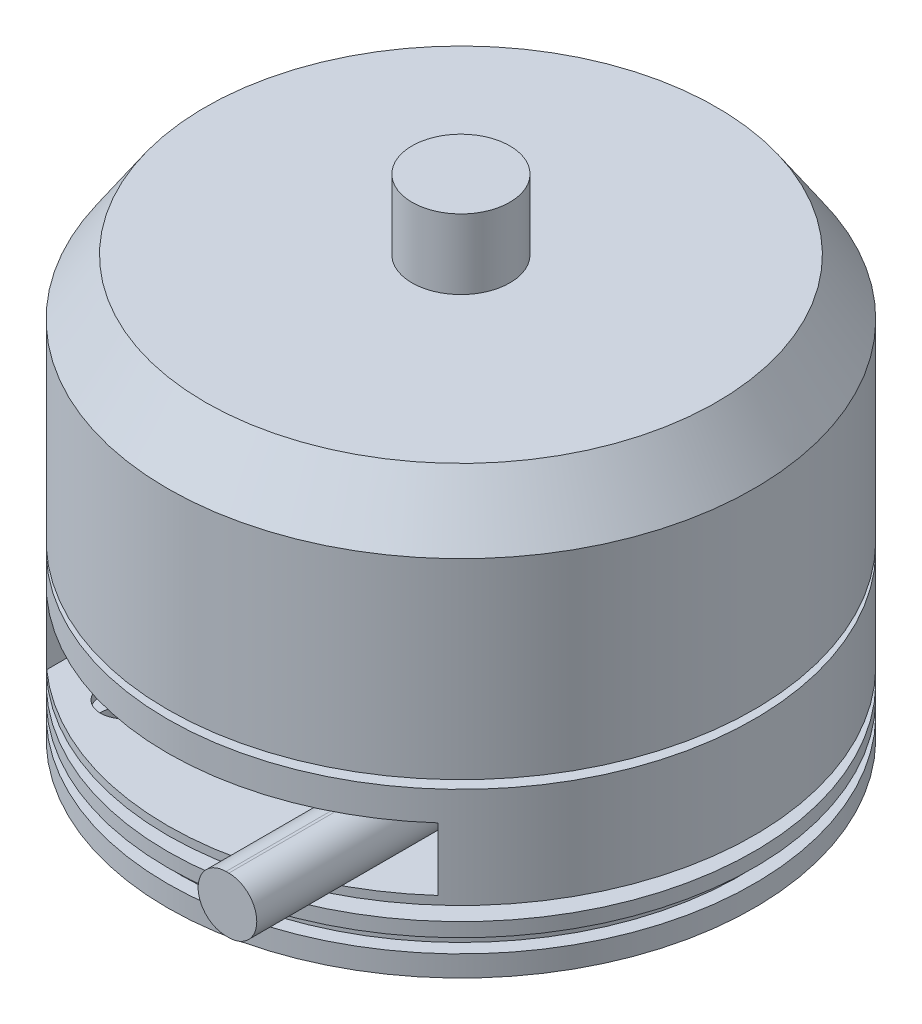
ISO-10303-21;
HEADER;
FILE_DESCRIPTION(('STEP AP214'),'2;1');
FILE_NAME('part.step','',(''),(''),'','','');
FILE_SCHEMA(('AUTOMOTIVE_DESIGN { 1 0 10303 214 1 1 1 1 }'));
ENDSEC;
DATA;
#1=APPLICATION_CONTEXT('core data for automotive mechanical design processes');
#2=APPLICATION_PROTOCOL_DEFINITION('international standard','automotive_design',2000,#1);
#3=PRODUCT_CONTEXT('',#1,'mechanical');
#4=PRODUCT('Part','Part','',(#3));
#5=PRODUCT_RELATED_PRODUCT_CATEGORY('part','',(#4));
#6=PRODUCT_DEFINITION_FORMATION('','',#4);
#7=PRODUCT_DEFINITION_CONTEXT('part definition',#1,'design');
#8=PRODUCT_DEFINITION('design','',#6,#7);
#9=PRODUCT_DEFINITION_SHAPE('','',#8);
#10=(LENGTH_UNIT() NAMED_UNIT(*) SI_UNIT(.MILLI.,.METRE.));
#11=(NAMED_UNIT(*) PLANE_ANGLE_UNIT() SI_UNIT($,.RADIAN.));
#12=(NAMED_UNIT(*) SI_UNIT($,.STERADIAN.) SOLID_ANGLE_UNIT());
#13=UNCERTAINTY_MEASURE_WITH_UNIT(LENGTH_MEASURE(1.E-05),#10,'distance_accuracy_value','');
#14=(GEOMETRIC_REPRESENTATION_CONTEXT(3) GLOBAL_UNCERTAINTY_ASSIGNED_CONTEXT((#13)) GLOBAL_UNIT_ASSIGNED_CONTEXT((#10,
#11,#12)) REPRESENTATION_CONTEXT('',''));
#15=CARTESIAN_POINT('',(0.,0.,0.));
#16=DIRECTION('',(0.,0.,1.));
#17=DIRECTION('',(1.,0.,0.));
#18=AXIS2_PLACEMENT_3D('',#15,#16,#17);
#19=CARTESIAN_POINT('',(13.4,8.7,0.));
#20=DIRECTION('',(0.,1.,0.));
#21=DIRECTION('',(0.,0.,1.));
#22=AXIS2_PLACEMENT_3D('',#19,#20,#21);
#23=PLANE('',#22);
#24=CARTESIAN_POINT('',(9.36869611910201,8.7,-14.7809855228913));
#25=DIRECTION('',(0.,-1.,0.));
#26=DIRECTION('',(0.,0.,-1.));
#27=AXIS2_PLACEMENT_3D('',#24,#25,#26);
#28=CIRCLE('',#27,1.64999999999999);
#29=CARTESIAN_POINT('',(9.36869611910201,8.7,-16.4309855228913));
#30=VERTEX_POINT('',#29);
#31=EDGE_CURVE('E152',#30,#30,#28,.T.);
#32=ORIENTED_EDGE('',*,*,#31,.F.);
#33=EDGE_LOOP('',(#32));
#34=FACE_BOUND('',#33,.T.);
#35=CARTESIAN_POINT('',(14.7809855228913,8.7,9.36869611910201));
#36=DIRECTION('',(0.,-1.,0.));
#37=DIRECTION('',(0.,0.,-1.));
#38=AXIS2_PLACEMENT_3D('',#35,#36,#37);
#39=CIRCLE('',#38,1.64999999999999);
#40=CARTESIAN_POINT('',(14.7809855228913,8.7,7.71869611910202));
#41=VERTEX_POINT('',#40);
#42=EDGE_CURVE('E162',#41,#41,#39,.T.);
#43=ORIENTED_EDGE('',*,*,#42,.F.);
#44=EDGE_LOOP('',(#43));
#45=FACE_BOUND('',#44,.T.);
#46=CARTESIAN_POINT('',(0.,8.7,0.));
#47=DIRECTION('',(0.,1.,0.));
#48=DIRECTION('',(0.,0.,1.));
#49=AXIS2_PLACEMENT_3D('',#46,#47,#48);
#50=CIRCLE('',#49,21.);
#51=CARTESIAN_POINT('',(0.,8.7,21.));
#52=VERTEX_POINT('',#51);
#53=EDGE_CURVE('E271',#52,#52,#50,.T.);
#54=ORIENTED_EDGE('',*,*,#53,.F.);
#55=EDGE_LOOP('',(#54));
#56=FACE_BOUND('',#55,.T.);
#57=CARTESIAN_POINT('',(0.,8.7,0.));
#58=DIRECTION('',(0.,1.,0.));
#59=DIRECTION('',(0.,0.,1.));
#60=AXIS2_PLACEMENT_3D('',#57,#58,#59);
#61=CIRCLE('',#60,13.4);
#62=CARTESIAN_POINT('',(0.,8.7,13.4));
#63=VERTEX_POINT('',#62);
#64=EDGE_CURVE('E274',#63,#63,#61,.T.);
#65=ORIENTED_EDGE('',*,*,#64,.T.);
#66=EDGE_LOOP('',(#65));
#67=FACE_BOUND('',#66,.T.);
#68=CARTESIAN_POINT('',(-9.36869611910201,8.7,14.7809855228913));
#69=DIRECTION('',(0.,-1.,0.));
#70=DIRECTION('',(0.,0.,-1.));
#71=AXIS2_PLACEMENT_3D('',#68,#69,#70);
#72=CIRCLE('',#71,1.64999999999999);
#73=CARTESIAN_POINT('',(-9.36869611910201,8.7,13.1309855228913));
#74=VERTEX_POINT('',#73);
#75=EDGE_CURVE('E136',#74,#74,#72,.T.);
#76=ORIENTED_EDGE('',*,*,#75,.F.);
#77=EDGE_LOOP('',(#76));
#78=FACE_BOUND('',#77,.T.);
#79=CARTESIAN_POINT('',(-14.7809855228913,8.7,-9.36869611910201));
#80=DIRECTION('',(0.,-1.,0.));
#81=DIRECTION('',(0.,0.,-1.));
#82=AXIS2_PLACEMENT_3D('',#79,#80,#81);
#83=CIRCLE('',#82,1.64999999999999);
#84=CARTESIAN_POINT('',(-14.7809855228913,8.7,-11.018696119102));
#85=VERTEX_POINT('',#84);
#86=EDGE_CURVE('E127',#85,#85,#83,.T.);
#87=ORIENTED_EDGE('',*,*,#86,.F.);
#88=EDGE_LOOP('',(#87));
#89=FACE_BOUND('',#88,.T.);
#90=ADVANCED_FACE('F40',(#34,#45,#56,#67,#78,#89),#23,.F.);
#91=CARTESIAN_POINT('',(0.,0.,11.));
#92=DIRECTION('',(0.,0.,1.));
#93=DIRECTION('',(1.,0.,0.));
#94=AXIS2_PLACEMENT_3D('',#91,#92,#93);
#95=PLANE('',#94);
#96=DIRECTION('',(0.,1.,0.));
#97=VECTOR('',#96,1.);
#98=CARTESIAN_POINT('',(14.,18.3,11.));
#99=LINE('',#98,#97);
#100=CARTESIAN_POINT('',(14.,13.8,11.));
#101=VERTEX_POINT('',#100);
#102=CARTESIAN_POINT('',(14.,18.3,11.));
#103=VERTEX_POINT('',#102);
#104=EDGE_CURVE('E201',#101,#103,#99,.T.);
#105=ORIENTED_EDGE('',*,*,#104,.T.);
#106=DIRECTION('',(-1.,0.,0.));
#107=VECTOR('',#106,1.);
#108=CARTESIAN_POINT('',(-14.,18.3,11.));
#109=LINE('',#108,#107);
#110=CARTESIAN_POINT('',(-14.,18.3,11.));
#111=VERTEX_POINT('',#110);
#112=EDGE_CURVE('E204',#103,#111,#109,.T.);
#113=ORIENTED_EDGE('',*,*,#112,.T.);
#114=DIRECTION('',(0.,-1.,0.));
#115=VECTOR('',#114,1.);
#116=CARTESIAN_POINT('',(-14.,18.3,11.));
#117=LINE('',#116,#115);
#118=CARTESIAN_POINT('',(-14.,13.8,11.));
#119=VERTEX_POINT('',#118);
#120=EDGE_CURVE('E207',#111,#119,#117,.T.);
#121=ORIENTED_EDGE('',*,*,#120,.T.);
#122=DIRECTION('',(1.,0.,0.));
#123=VECTOR('',#122,1.);
#124=CARTESIAN_POINT('',(-14.,13.8,11.));
#125=LINE('',#124,#123);
#126=EDGE_CURVE('E210',#119,#101,#125,.T.);
#127=ORIENTED_EDGE('',*,*,#126,.T.);
#128=EDGE_LOOP('',(#105,#113,#121,#127));
#129=FACE_BOUND('',#128,.T.);
#130=DIRECTION('',(1.,0.,0.));
#131=VECTOR('',#130,1.);
#132=CARTESIAN_POINT('',(9.18505632343501,14.0531944170925,11.));
#133=LINE('',#132,#131);
#134=CARTESIAN_POINT('',(9.18505632343501,14.0531944170925,11.));
#135=VERTEX_POINT('',#134);
#136=CARTESIAN_POINT('',(9.38505632343501,14.0531944170925,11.));
#137=VERTEX_POINT('',#136);
#138=EDGE_CURVE('E188',#135,#137,#133,.T.);
#139=ORIENTED_EDGE('',*,*,#138,.F.);
#140=CARTESIAN_POINT('',(9.18505632343501,16.0531944170925,11.));
#141=DIRECTION('',(0.,0.,1.));
#142=DIRECTION('',(1.,0.,0.));
#143=AXIS2_PLACEMENT_3D('',#140,#141,#142);
#144=CIRCLE('',#143,1.99999999999999);
#145=CARTESIAN_POINT('',(9.18505632343501,18.0531944170925,11.));
#146=VERTEX_POINT('',#145);
#147=EDGE_CURVE('E174',#146,#135,#144,.T.);
#148=ORIENTED_EDGE('',*,*,#147,.F.);
#149=DIRECTION('',(-1.,0.,0.));
#150=VECTOR('',#149,1.);
#151=CARTESIAN_POINT('',(9.18505632343501,18.0531944170925,11.));
#152=LINE('',#151,#150);
#153=CARTESIAN_POINT('',(9.38505632343501,18.0531944170925,11.));
#154=VERTEX_POINT('',#153);
#155=EDGE_CURVE('E179',#154,#146,#152,.T.);
#156=ORIENTED_EDGE('',*,*,#155,.F.);
#157=CARTESIAN_POINT('',(9.38505632343501,16.0531944170925,11.));
#158=DIRECTION('',(0.,0.,1.));
#159=DIRECTION('',(1.,0.,0.));
#160=AXIS2_PLACEMENT_3D('',#157,#158,#159);
#161=CIRCLE('',#160,2.);
#162=EDGE_CURVE('E190',#137,#154,#161,.T.);
#163=ORIENTED_EDGE('',*,*,#162,.F.);
#164=EDGE_LOOP('',(#139,#148,#156,#163));
#165=FACE_BOUND('',#164,.T.);
#166=ADVANCED_FACE('F319',(#129,#165),#95,.T.);
#167=CARTESIAN_POINT('',(0.,0.,0.));
#168=DIRECTION('',(0.,1.,0.));
#169=DIRECTION('',(0.,0.,1.));
#170=AXIS2_PLACEMENT_3D('',#167,#168,#169);
#171=PLANE('',#170);
#172=CARTESIAN_POINT('',(0.,0.,0.));
#173=DIRECTION('',(0.,1.,0.));
#174=DIRECTION('',(0.,0.,1.));
#175=AXIS2_PLACEMENT_3D('',#172,#173,#174);
#176=CIRCLE('',#175,4.1);
#177=CARTESIAN_POINT('',(0.,0.,4.1));
#178=VERTEX_POINT('',#177);
#179=EDGE_CURVE('E283',#178,#178,#176,.T.);
#180=ORIENTED_EDGE('',*,*,#179,.F.);
#181=EDGE_LOOP('',(#180));
#182=FACE_BOUND('',#181,.T.);
#183=ADVANCED_FACE('F42',(#182),#171,.F.);
#184=CARTESIAN_POINT('',(0.,43.7,0.));
#185=DIRECTION('',(0.,1.,0.));
#186=DIRECTION('',(0.,0.,1.));
#187=AXIS2_PLACEMENT_3D('',#184,#185,#186);
#188=CYLINDRICAL_SURFACE('',#187,4.1);
#189=CARTESIAN_POINT('',(0.,6.7,0.));
#190=DIRECTION('',(0.,1.,0.));
#191=DIRECTION('',(0.,0.,1.));
#192=AXIS2_PLACEMENT_3D('',#189,#190,#191);
#193=CIRCLE('',#192,4.1);
#194=CARTESIAN_POINT('',(0.,6.7,4.1));
#195=VERTEX_POINT('',#194);
#196=EDGE_CURVE('E280',#195,#195,#193,.T.);
#197=ORIENTED_EDGE('',*,*,#196,.F.);
#198=EDGE_LOOP('',(#197));
#199=FACE_BOUND('',#198,.T.);
#200=ORIENTED_EDGE('',*,*,#179,.T.);
#201=EDGE_LOOP('',(#200));
#202=FACE_BOUND('',#201,.T.);
#203=ADVANCED_FACE('F339',(#199,#202),#188,.T.);
#204=CARTESIAN_POINT('',(4.1,6.7,0.));
#205=DIRECTION('',(0.,1.,0.));
#206=DIRECTION('',(0.,0.,1.));
#207=AXIS2_PLACEMENT_3D('',#204,#205,#206);
#208=PLANE('',#207);
#209=CARTESIAN_POINT('',(0.,6.7,0.));
#210=DIRECTION('',(0.,1.,0.));
#211=DIRECTION('',(0.,0.,1.));
#212=AXIS2_PLACEMENT_3D('',#209,#210,#211);
#213=CIRCLE('',#212,13.4);
#214=CARTESIAN_POINT('',(0.,6.7,13.4));
#215=VERTEX_POINT('',#214);
#216=EDGE_CURVE('E277',#215,#215,#213,.T.);
#217=ORIENTED_EDGE('',*,*,#216,.F.);
#218=EDGE_LOOP('',(#217));
#219=FACE_BOUND('',#218,.T.);
#220=ORIENTED_EDGE('',*,*,#196,.T.);
#221=EDGE_LOOP('',(#220));
#222=FACE_BOUND('',#221,.T.);
#223=ADVANCED_FACE('F336',(#219,#222),#208,.F.);
#224=CARTESIAN_POINT('',(0.,43.7,0.));
#225=DIRECTION('',(0.,1.,0.));
#226=DIRECTION('',(0.,0.,1.));
#227=AXIS2_PLACEMENT_3D('',#224,#225,#226);
#228=CYLINDRICAL_SURFACE('',#227,13.4);
#229=ORIENTED_EDGE('',*,*,#64,.F.);
#230=EDGE_LOOP('',(#229));
#231=FACE_BOUND('',#230,.T.);
#232=ORIENTED_EDGE('',*,*,#216,.T.);
#233=EDGE_LOOP('',(#232));
#234=FACE_BOUND('',#233,.T.);
#235=ADVANCED_FACE('F333',(#231,#234),#228,.T.);
#236=CARTESIAN_POINT('',(0.,43.7,0.));
#237=DIRECTION('',(0.,1.,0.));
#238=DIRECTION('',(0.,0.,1.));
#239=AXIS2_PLACEMENT_3D('',#236,#237,#238);
#240=CYLINDRICAL_SURFACE('',#239,21.);
#241=CARTESIAN_POINT('',(0.,10.2,0.));
#242=DIRECTION('',(0.,1.,0.));
#243=DIRECTION('',(0.,0.,1.));
#244=AXIS2_PLACEMENT_3D('',#241,#242,#243);
#245=CIRCLE('',#244,21.);
#246=CARTESIAN_POINT('',(0.,10.2,21.));
#247=VERTEX_POINT('',#246);
#248=EDGE_CURVE('E268',#247,#247,#245,.T.);
#249=ORIENTED_EDGE('',*,*,#248,.F.);
#250=EDGE_LOOP('',(#249));
#251=FACE_BOUND('',#250,.T.);
#252=ORIENTED_EDGE('',*,*,#53,.T.);
#253=EDGE_LOOP('',(#252));
#254=FACE_BOUND('',#253,.T.);
#255=ADVANCED_FACE('F331',(#251,#254),#240,.T.);
#256=CARTESIAN_POINT('',(21.,10.2,0.));
#257=DIRECTION('',(0.,-1.,0.));
#258=DIRECTION('',(0.,0.,-1.));
#259=AXIS2_PLACEMENT_3D('',#256,#257,#258);
#260=PLANE('',#259);
#261=CARTESIAN_POINT('',(0.,10.2,0.));
#262=DIRECTION('',(0.,1.,0.));
#263=DIRECTION('',(0.,0.,1.));
#264=AXIS2_PLACEMENT_3D('',#261,#262,#263);
#265=CIRCLE('',#264,20.);
#266=CARTESIAN_POINT('',(0.,10.2,20.));
#267=VERTEX_POINT('',#266);
#268=EDGE_CURVE('E265',#267,#267,#265,.T.);
#269=ORIENTED_EDGE('',*,*,#268,.F.);
#270=EDGE_LOOP('',(#269));
#271=FACE_BOUND('',#270,.T.);
#272=ORIENTED_EDGE('',*,*,#248,.T.);
#273=EDGE_LOOP('',(#272));
#274=FACE_BOUND('',#273,.T.);
#275=ADVANCED_FACE('F708',(#271,#274),#260,.F.);
#276=CARTESIAN_POINT('',(0.,43.7,0.));
#277=DIRECTION('',(0.,1.,0.));
#278=DIRECTION('',(0.,0.,1.));
#279=AXIS2_PLACEMENT_3D('',#276,#277,#278);
#280=CYLINDRICAL_SURFACE('',#279,20.);
#281=CARTESIAN_POINT('',(0.,11.2,0.));
#282=DIRECTION('',(0.,1.,0.));
#283=DIRECTION('',(0.,0.,1.));
#284=AXIS2_PLACEMENT_3D('',#281,#282,#283);
#285=CIRCLE('',#284,20.);
#286=CARTESIAN_POINT('',(0.,11.2,20.));
#287=VERTEX_POINT('',#286);
#288=EDGE_CURVE('E262',#287,#287,#285,.T.);
#289=ORIENTED_EDGE('',*,*,#288,.F.);
#290=EDGE_LOOP('',(#289));
#291=FACE_BOUND('',#290,.T.);
#292=ORIENTED_EDGE('',*,*,#268,.T.);
#293=EDGE_LOOP('',(#292));
#294=FACE_BOUND('',#293,.T.);
#295=ADVANCED_FACE('F705',(#291,#294),#280,.T.);
#296=CARTESIAN_POINT('',(20.,11.2,0.));
#297=DIRECTION('',(0.,1.,0.));
#298=DIRECTION('',(0.,0.,1.));
#299=AXIS2_PLACEMENT_3D('',#296,#297,#298);
#300=PLANE('',#299);
#301=CARTESIAN_POINT('',(0.,11.2,0.));
#302=DIRECTION('',(0.,1.,0.));
#303=DIRECTION('',(0.,0.,1.));
#304=AXIS2_PLACEMENT_3D('',#301,#302,#303);
#305=CIRCLE('',#304,21.);
#306=CARTESIAN_POINT('',(0.,11.2,21.));
#307=VERTEX_POINT('',#306);
#308=EDGE_CURVE('E259',#307,#307,#305,.T.);
#309=ORIENTED_EDGE('',*,*,#308,.F.);
#310=EDGE_LOOP('',(#309));
#311=FACE_BOUND('',#310,.T.);
#312=ORIENTED_EDGE('',*,*,#288,.T.);
#313=EDGE_LOOP('',(#312));
#314=FACE_BOUND('',#313,.T.);
#315=ADVANCED_FACE('F701',(#311,#314),#300,.F.);
#316=CARTESIAN_POINT('',(0.,43.7,0.));
#317=DIRECTION('',(0.,1.,0.));
#318=DIRECTION('',(0.,0.,1.));
#319=AXIS2_PLACEMENT_3D('',#316,#317,#318);
#320=CYLINDRICAL_SURFACE('',#319,21.);
#321=CARTESIAN_POINT('',(0.,12.2,0.));
#322=DIRECTION('',(0.,1.,0.));
#323=DIRECTION('',(0.,0.,1.));
#324=AXIS2_PLACEMENT_3D('',#321,#322,#323);
#325=CIRCLE('',#324,21.);
#326=CARTESIAN_POINT('',(0.,12.2,21.));
#327=VERTEX_POINT('',#326);
#328=EDGE_CURVE('E256',#327,#327,#325,.T.);
#329=ORIENTED_EDGE('',*,*,#328,.F.);
#330=EDGE_LOOP('',(#329));
#331=FACE_BOUND('',#330,.T.);
#332=ORIENTED_EDGE('',*,*,#308,.T.);
#333=EDGE_LOOP('',(#332));
#334=FACE_BOUND('',#333,.T.);
#335=ADVANCED_FACE('F433',(#331,#334),#320,.T.);
#336=CARTESIAN_POINT('',(21.,12.2,0.));
#337=DIRECTION('',(0.,-1.,0.));
#338=DIRECTION('',(0.,0.,-1.));
#339=AXIS2_PLACEMENT_3D('',#336,#337,#338);
#340=PLANE('',#339);
#341=CARTESIAN_POINT('',(-14.7809855228913,12.2,-9.36869611910201));
#342=DIRECTION('',(0.,-1.,0.));
#343=DIRECTION('',(0.,0.,-1.));
#344=AXIS2_PLACEMENT_3D('',#341,#342,#343);
#345=CIRCLE('',#344,1.64999999999999);
#346=CARTESIAN_POINT('',(-14.7809855228913,12.2,-11.018696119102));
#347=VERTEX_POINT('',#346);
#348=EDGE_CURVE('E44',#347,#347,#345,.T.);
#349=ORIENTED_EDGE('',*,*,#348,.T.);
#350=EDGE_LOOP('',(#349));
#351=FACE_BOUND('',#350,.T.);
#352=CARTESIAN_POINT('',(-9.36869611910201,12.2,14.7809855228913));
#353=DIRECTION('',(0.,-1.,0.));
#354=DIRECTION('',(0.,0.,-1.));
#355=AXIS2_PLACEMENT_3D('',#352,#353,#354);
#356=CIRCLE('',#355,1.64999999999999);
#357=CARTESIAN_POINT('',(-9.36869611910201,12.2,13.1309855228913));
#358=VERTEX_POINT('',#357);
#359=EDGE_CURVE('E149',#358,#358,#356,.T.);
#360=ORIENTED_EDGE('',*,*,#359,.T.);
#361=EDGE_LOOP('',(#360));
#362=FACE_BOUND('',#361,.T.);
#363=CARTESIAN_POINT('',(9.36869611910201,12.2,-14.7809855228913));
#364=DIRECTION('',(0.,-1.,0.));
#365=DIRECTION('',(0.,0.,-1.));
#366=AXIS2_PLACEMENT_3D('',#363,#364,#365);
#367=CIRCLE('',#366,1.64999999999999);
#368=CARTESIAN_POINT('',(9.36869611910201,12.2,-16.4309855228913));
#369=VERTEX_POINT('',#368);
#370=EDGE_CURVE('E159',#369,#369,#367,.T.);
#371=ORIENTED_EDGE('',*,*,#370,.T.);
#372=EDGE_LOOP('',(#371));
#373=FACE_BOUND('',#372,.T.);
#374=CARTESIAN_POINT('',(14.7809855228913,12.2,9.36869611910201));
#375=DIRECTION('',(0.,-1.,0.));
#376=DIRECTION('',(0.,0.,-1.));
#377=AXIS2_PLACEMENT_3D('',#374,#375,#376);
#378=CIRCLE('',#377,1.64999999999999);
#379=CARTESIAN_POINT('',(14.7809855228913,12.2,7.71869611910202));
#380=VERTEX_POINT('',#379);
#381=EDGE_CURVE('E168',#380,#380,#378,.T.);
#382=ORIENTED_EDGE('',*,*,#381,.T.);
#383=EDGE_LOOP('',(#382));
#384=FACE_BOUND('',#383,.T.);
#385=CARTESIAN_POINT('',(0.,12.2,0.));
#386=DIRECTION('',(0.,1.,0.));
#387=DIRECTION('',(0.,0.,1.));
#388=AXIS2_PLACEMENT_3D('',#385,#386,#387);
#389=CIRCLE('',#388,10.);
#390=CARTESIAN_POINT('',(0.,12.2,10.));
#391=VERTEX_POINT('',#390);
#392=EDGE_CURVE('E253',#391,#391,#389,.T.);
#393=ORIENTED_EDGE('',*,*,#392,.F.);
#394=EDGE_LOOP('',(#393));
#395=FACE_BOUND('',#394,.T.);
#396=ORIENTED_EDGE('',*,*,#328,.T.);
#397=EDGE_LOOP('',(#396));
#398=FACE_BOUND('',#397,.T.);
#399=ADVANCED_FACE('F427',(#351,#362,#373,#384,#395,#398),#340,.F.);
#400=CARTESIAN_POINT('',(0.,43.7,0.));
#401=DIRECTION('',(0.,1.,0.));
#402=DIRECTION('',(0.,0.,1.));
#403=AXIS2_PLACEMENT_3D('',#400,#401,#402);
#404=CYLINDRICAL_SURFACE('',#403,10.);
#405=CARTESIAN_POINT('',(0.,13.2,0.));
#406=DIRECTION('',(0.,1.,0.));
#407=DIRECTION('',(0.,0.,1.));
#408=AXIS2_PLACEMENT_3D('',#405,#406,#407);
#409=CIRCLE('',#408,10.);
#410=CARTESIAN_POINT('',(0.,13.2,10.));
#411=VERTEX_POINT('',#410);
#412=EDGE_CURVE('E250',#411,#411,#409,.T.);
#413=ORIENTED_EDGE('',*,*,#412,.F.);
#414=EDGE_LOOP('',(#413));
#415=FACE_BOUND('',#414,.T.);
#416=ORIENTED_EDGE('',*,*,#392,.T.);
#417=EDGE_LOOP('',(#416));
#418=FACE_BOUND('',#417,.T.);
#419=ADVANCED_FACE('F432',(#415,#418),#404,.T.);
#420=CARTESIAN_POINT('',(10.,13.2,0.));
#421=DIRECTION('',(0.,1.,0.));
#422=DIRECTION('',(0.,0.,1.));
#423=AXIS2_PLACEMENT_3D('',#420,#421,#422);
#424=PLANE('',#423);
#425=CARTESIAN_POINT('',(-14.7809855228913,13.2,-9.36869611910201));
#426=DIRECTION('',(0.,1.,0.));
#427=DIRECTION('',(0.,0.,1.));
#428=AXIS2_PLACEMENT_3D('',#425,#426,#427);
#429=CIRCLE('',#428,1.64999999999999);
#430=CARTESIAN_POINT('',(-14.7809855228913,13.2,-7.71869611910202));
#431=VERTEX_POINT('',#430);
#432=EDGE_CURVE('E130',#431,#431,#429,.T.);
#433=ORIENTED_EDGE('',*,*,#432,.T.);
#434=EDGE_LOOP('',(#433));
#435=FACE_BOUND('',#434,.T.);
#436=CARTESIAN_POINT('',(-9.36869611910201,13.2,14.7809855228913));
#437=DIRECTION('',(0.,1.,0.));
#438=DIRECTION('',(0.,0.,1.));
#439=AXIS2_PLACEMENT_3D('',#436,#437,#438);
#440=CIRCLE('',#439,1.64999999999999);
#441=CARTESIAN_POINT('',(-9.36869611910201,13.2,16.4309855228913));
#442=VERTEX_POINT('',#441);
#443=EDGE_CURVE('E146',#442,#442,#440,.T.);
#444=ORIENTED_EDGE('',*,*,#443,.T.);
#445=EDGE_LOOP('',(#444));
#446=FACE_BOUND('',#445,.T.);
#447=CARTESIAN_POINT('',(9.36869611910201,13.2,-14.7809855228913));
#448=DIRECTION('',(0.,1.,0.));
#449=DIRECTION('',(0.,0.,1.));
#450=AXIS2_PLACEMENT_3D('',#447,#448,#449);
#451=CIRCLE('',#450,1.64999999999999);
#452=CARTESIAN_POINT('',(9.36869611910201,13.2,-13.1309855228913));
#453=VERTEX_POINT('',#452);
#454=EDGE_CURVE('E158',#453,#453,#451,.T.);
#455=ORIENTED_EDGE('',*,*,#454,.T.);
#456=EDGE_LOOP('',(#455));
#457=FACE_BOUND('',#456,.T.);
#458=CARTESIAN_POINT('',(14.7809855228913,13.2,9.36869611910201));
#459=DIRECTION('',(0.,1.,0.));
#460=DIRECTION('',(0.,0.,1.));
#461=AXIS2_PLACEMENT_3D('',#458,#459,#460);
#462=CIRCLE('',#461,1.64999999999999);
#463=CARTESIAN_POINT('',(14.7809855228913,13.2,11.018696119102));
#464=VERTEX_POINT('',#463);
#465=EDGE_CURVE('E171',#464,#464,#462,.T.);
#466=ORIENTED_EDGE('',*,*,#465,.T.);
#467=EDGE_LOOP('',(#466));
#468=FACE_BOUND('',#467,.T.);
#469=CARTESIAN_POINT('',(0.,13.2,0.));
#470=DIRECTION('',(0.,1.,0.));
#471=DIRECTION('',(0.,0.,1.));
#472=AXIS2_PLACEMENT_3D('',#469,#470,#471);
#473=CIRCLE('',#472,21.);
#474=CARTESIAN_POINT('',(0.,13.2,21.));
#475=VERTEX_POINT('',#474);
#476=EDGE_CURVE('E247',#475,#475,#473,.T.);
#477=ORIENTED_EDGE('',*,*,#476,.F.);
#478=EDGE_LOOP('',(#477));
#479=FACE_BOUND('',#478,.T.);
#480=ORIENTED_EDGE('',*,*,#412,.T.);
#481=EDGE_LOOP('',(#480));
#482=FACE_BOUND('',#481,.T.);
#483=ADVANCED_FACE('F443',(#435,#446,#457,#468,#479,#482),#424,.F.);
#484=CARTESIAN_POINT('',(0.,43.7,0.));
#485=DIRECTION('',(0.,1.,0.));
#486=DIRECTION('',(0.,0.,1.));
#487=AXIS2_PLACEMENT_3D('',#484,#485,#486);
#488=CYLINDRICAL_SURFACE('',#487,21.);
#489=CARTESIAN_POINT('',(0.,18.3,0.));
#490=DIRECTION('',(0.,1.,0.));
#491=DIRECTION('',(0.,0.,1.));
#492=AXIS2_PLACEMENT_3D('',#489,#490,#491);
#493=CIRCLE('',#492,21.);
#494=CARTESIAN_POINT('',(-14.,18.3,15.6524758424985));
#495=VERTEX_POINT('',#494);
#496=CARTESIAN_POINT('',(14.,18.3,15.6524758424985));
#497=VERTEX_POINT('',#496);
#498=EDGE_CURVE('E286',#495,#497,#493,.T.);
#499=ORIENTED_EDGE('',*,*,#498,.T.);
#500=DIRECTION('',(0.,1.,0.));
#501=VECTOR('',#500,1.);
#502=CARTESIAN_POINT('',(14.,43.7,15.6524758424985));
#503=LINE('',#502,#501);
#504=CARTESIAN_POINT('',(14.,13.8,15.6524758424985));
#505=VERTEX_POINT('',#504);
#506=EDGE_CURVE('E11',#497,#505,#503,.F.);
#507=ORIENTED_EDGE('',*,*,#506,.T.);
#508=CARTESIAN_POINT('',(0.,13.8,0.));
#509=DIRECTION('',(0.,-1.,0.));
#510=DIRECTION('',(0.,0.,-1.));
#511=AXIS2_PLACEMENT_3D('',#508,#509,#510);
#512=CIRCLE('',#511,21.);
#513=CARTESIAN_POINT('',(-14.,13.8,15.6524758424985));
#514=VERTEX_POINT('',#513);
#515=EDGE_CURVE('E49',#505,#514,#512,.T.);
#516=ORIENTED_EDGE('',*,*,#515,.T.);
#517=DIRECTION('',(0.,1.,0.));
#518=VECTOR('',#517,1.);
#519=CARTESIAN_POINT('',(-14.,43.7,15.6524758424985));
#520=LINE('',#519,#518);
#521=EDGE_CURVE('E288',#514,#495,#520,.T.);
#522=ORIENTED_EDGE('',*,*,#521,.T.);
#523=EDGE_LOOP('',(#499,#507,#516,#522));
#524=FACE_BOUND('',#523,.T.);
#525=CARTESIAN_POINT('',(0.,20.4,0.));
#526=DIRECTION('',(0.,1.,0.));
#527=DIRECTION('',(0.,0.,1.));
#528=AXIS2_PLACEMENT_3D('',#525,#526,#527);
#529=CIRCLE('',#528,21.);
#530=CARTESIAN_POINT('',(0.,20.4,21.));
#531=VERTEX_POINT('',#530);
#532=EDGE_CURVE('E244',#531,#531,#529,.T.);
#533=ORIENTED_EDGE('',*,*,#532,.F.);
#534=EDGE_LOOP('',(#533));
#535=FACE_BOUND('',#534,.T.);
#536=ORIENTED_EDGE('',*,*,#476,.T.);
#537=EDGE_LOOP('',(#536));
#538=FACE_BOUND('',#537,.T.);
#539=ADVANCED_FACE('F448',(#524,#535,#538),#488,.T.);
#540=CARTESIAN_POINT('',(21.,20.4,0.));
#541=DIRECTION('',(0.,-1.,0.));
#542=DIRECTION('',(0.,0.,-1.));
#543=AXIS2_PLACEMENT_3D('',#540,#541,#542);
#544=PLANE('',#543);
#545=CARTESIAN_POINT('',(0.,20.4,0.));
#546=DIRECTION('',(0.,1.,0.));
#547=DIRECTION('',(0.,0.,1.));
#548=AXIS2_PLACEMENT_3D('',#545,#546,#547);
#549=CIRCLE('',#548,5.);
#550=CARTESIAN_POINT('',(0.,20.4,5.));
#551=VERTEX_POINT('',#550);
#552=EDGE_CURVE('E241',#551,#551,#549,.T.);
#553=ORIENTED_EDGE('',*,*,#552,.F.);
#554=EDGE_LOOP('',(#553));
#555=FACE_BOUND('',#554,.T.);
#556=ORIENTED_EDGE('',*,*,#532,.T.);
#557=EDGE_LOOP('',(#556));
#558=FACE_BOUND('',#557,.T.);
#559=ADVANCED_FACE('F626',(#555,#558),#544,.F.);
#560=CARTESIAN_POINT('',(0.,43.7,0.));
#561=DIRECTION('',(0.,1.,0.));
#562=DIRECTION('',(0.,0.,1.));
#563=AXIS2_PLACEMENT_3D('',#560,#561,#562);
#564=CYLINDRICAL_SURFACE('',#563,5.);
#565=CARTESIAN_POINT('',(0.,21.,0.));
#566=DIRECTION('',(0.,1.,0.));
#567=DIRECTION('',(0.,0.,1.));
#568=AXIS2_PLACEMENT_3D('',#565,#566,#567);
#569=CIRCLE('',#568,5.);
#570=CARTESIAN_POINT('',(0.,21.,5.));
#571=VERTEX_POINT('',#570);
#572=EDGE_CURVE('E238',#571,#571,#569,.T.);
#573=ORIENTED_EDGE('',*,*,#572,.F.);
#574=EDGE_LOOP('',(#573));
#575=FACE_BOUND('',#574,.T.);
#576=ORIENTED_EDGE('',*,*,#552,.T.);
#577=EDGE_LOOP('',(#576));
#578=FACE_BOUND('',#577,.T.);
#579=ADVANCED_FACE('F637',(#575,#578),#564,.T.);
#580=CARTESIAN_POINT('',(5.,21.,0.));
#581=DIRECTION('',(0.,1.,0.));
#582=DIRECTION('',(0.,0.,1.));
#583=AXIS2_PLACEMENT_3D('',#580,#581,#582);
#584=PLANE('',#583);
#585=CARTESIAN_POINT('',(0.,21.,0.));
#586=DIRECTION('',(0.,1.,0.));
#587=DIRECTION('',(0.,0.,1.));
#588=AXIS2_PLACEMENT_3D('',#585,#586,#587);
#589=CIRCLE('',#588,21.);
#590=CARTESIAN_POINT('',(0.,21.,21.));
#591=VERTEX_POINT('',#590);
#592=EDGE_CURVE('E235',#591,#591,#589,.T.);
#593=ORIENTED_EDGE('',*,*,#592,.F.);
#594=EDGE_LOOP('',(#593));
#595=FACE_BOUND('',#594,.T.);
#596=ORIENTED_EDGE('',*,*,#572,.T.);
#597=EDGE_LOOP('',(#596));
#598=FACE_BOUND('',#597,.T.);
#599=ADVANCED_FACE('F645',(#595,#598),#584,.F.);
#600=CARTESIAN_POINT('',(0.,43.7,0.));
#601=DIRECTION('',(0.,1.,0.));
#602=DIRECTION('',(0.,0.,1.));
#603=AXIS2_PLACEMENT_3D('',#600,#601,#602);
#604=CYLINDRICAL_SURFACE('',#603,21.);
#605=CARTESIAN_POINT('',(0.,34.7,0.));
#606=DIRECTION('',(0.,1.,0.));
#607=DIRECTION('',(0.,0.,1.));
#608=AXIS2_PLACEMENT_3D('',#605,#606,#607);
#609=CIRCLE('',#608,21.);
#610=CARTESIAN_POINT('',(0.,34.7,21.));
#611=VERTEX_POINT('',#610);
#612=EDGE_CURVE('E232',#611,#611,#609,.T.);
#613=ORIENTED_EDGE('',*,*,#612,.F.);
#614=EDGE_LOOP('',(#613));
#615=FACE_BOUND('',#614,.T.);
#616=ORIENTED_EDGE('',*,*,#592,.T.);
#617=EDGE_LOOP('',(#616));
#618=FACE_BOUND('',#617,.T.);
#619=ADVANCED_FACE('F653',(#615,#618),#604,.T.);
#620=CARTESIAN_POINT('',(0.,34.7,0.));
#621=DIRECTION('',(0.,-1.,0.));
#622=DIRECTION('',(0.,0.,-1.));
#623=AXIS2_PLACEMENT_3D('',#620,#621,#622);
#624=CONICAL_SURFACE('',#623,21.,0.593749666710772);
#625=CARTESIAN_POINT('',(0.,38.7,0.));
#626=DIRECTION('',(0.,1.,0.));
#627=DIRECTION('',(0.,0.,1.));
#628=AXIS2_PLACEMENT_3D('',#625,#626,#627);
#629=CIRCLE('',#628,18.3);
#630=CARTESIAN_POINT('',(0.,38.7,18.3));
#631=VERTEX_POINT('',#630);
#632=EDGE_CURVE('E229',#631,#631,#629,.T.);
#633=ORIENTED_EDGE('',*,*,#632,.F.);
#634=EDGE_LOOP('',(#633));
#635=FACE_BOUND('',#634,.T.);
#636=ORIENTED_EDGE('',*,*,#612,.T.);
#637=EDGE_LOOP('',(#636));
#638=FACE_BOUND('',#637,.T.);
#639=ADVANCED_FACE('F662',(#635,#638),#624,.T.);
#640=CARTESIAN_POINT('',(18.3,38.7,0.));
#641=DIRECTION('',(0.,-1.,0.));
#642=DIRECTION('',(0.,0.,-1.));
#643=AXIS2_PLACEMENT_3D('',#640,#641,#642);
#644=PLANE('',#643);
#645=CARTESIAN_POINT('',(0.,38.7,0.));
#646=DIRECTION('',(0.,1.,0.));
#647=DIRECTION('',(0.,0.,1.));
#648=AXIS2_PLACEMENT_3D('',#645,#646,#647);
#649=CIRCLE('',#648,3.5);
#650=CARTESIAN_POINT('',(0.,38.7,3.5));
#651=VERTEX_POINT('',#650);
#652=EDGE_CURVE('E226',#651,#651,#649,.T.);
#653=ORIENTED_EDGE('',*,*,#652,.F.);
#654=EDGE_LOOP('',(#653));
#655=FACE_BOUND('',#654,.T.);
#656=ORIENTED_EDGE('',*,*,#632,.T.);
#657=EDGE_LOOP('',(#656));
#658=FACE_BOUND('',#657,.T.);
#659=ADVANCED_FACE('F602',(#655,#658),#644,.F.);
#660=CARTESIAN_POINT('',(0.,43.7,0.));
#661=DIRECTION('',(0.,1.,0.));
#662=DIRECTION('',(0.,0.,1.));
#663=AXIS2_PLACEMENT_3D('',#660,#661,#662);
#664=CYLINDRICAL_SURFACE('',#663,3.5);
#665=CARTESIAN_POINT('',(0.,43.7,0.));
#666=DIRECTION('',(0.,1.,0.));
#667=DIRECTION('',(0.,0.,1.));
#668=AXIS2_PLACEMENT_3D('',#665,#666,#667);
#669=CIRCLE('',#668,3.5);
#670=CARTESIAN_POINT('',(0.,43.7,3.5));
#671=VERTEX_POINT('',#670);
#672=EDGE_CURVE('E216',#671,#671,#669,.T.);
#673=ORIENTED_EDGE('',*,*,#672,.F.);
#674=EDGE_LOOP('',(#673));
#675=FACE_BOUND('',#674,.T.);
#676=ORIENTED_EDGE('',*,*,#652,.T.);
#677=EDGE_LOOP('',(#676));
#678=FACE_BOUND('',#677,.T.);
#679=ADVANCED_FACE('F597',(#675,#678),#664,.T.);
#680=CARTESIAN_POINT('',(3.5,43.7,0.));
#681=DIRECTION('',(0.,-1.,0.));
#682=DIRECTION('',(0.,0.,-1.));
#683=AXIS2_PLACEMENT_3D('',#680,#681,#682);
#684=PLANE('',#683);
#685=ORIENTED_EDGE('',*,*,#672,.T.);
#686=EDGE_LOOP('',(#685));
#687=FACE_BOUND('',#686,.T.);
#688=ADVANCED_FACE('F601',(#687),#684,.F.);
#689=CARTESIAN_POINT('',(14.,18.3,11.));
#690=DIRECTION('',(1.,0.,0.));
#691=DIRECTION('',(0.,0.,-1.));
#692=AXIS2_PLACEMENT_3D('',#689,#690,#691);
#693=PLANE('',#692);
#694=DIRECTION('',(0.,0.,1.));
#695=VECTOR('',#694,1.);
#696=CARTESIAN_POINT('',(14.,18.3,11.));
#697=LINE('',#696,#695);
#698=EDGE_CURVE('E213',#103,#497,#697,.T.);
#699=ORIENTED_EDGE('',*,*,#698,.F.);
#700=ORIENTED_EDGE('',*,*,#104,.F.);
#701=DIRECTION('',(0.,0.,1.));
#702=VECTOR('',#701,1.);
#703=CARTESIAN_POINT('',(14.,13.8,11.));
#704=LINE('',#703,#702);
#705=EDGE_CURVE('E214',#101,#505,#704,.T.);
#706=ORIENTED_EDGE('',*,*,#705,.T.);
#707=ORIENTED_EDGE('',*,*,#506,.F.);
#708=EDGE_LOOP('',(#699,#700,#706,#707));
#709=FACE_BOUND('',#708,.T.);
#710=ADVANCED_FACE('F461',(#709),#693,.F.);
#711=CARTESIAN_POINT('',(-14.,13.8,11.));
#712=DIRECTION('',(0.,-1.,0.));
#713=DIRECTION('',(0.,0.,-1.));
#714=AXIS2_PLACEMENT_3D('',#711,#712,#713);
#715=PLANE('',#714);
#716=CARTESIAN_POINT('',(-9.36869611910201,13.8,14.7809855228913));
#717=DIRECTION('',(0.,-1.,0.));
#718=DIRECTION('',(0.,0.,-1.));
#719=AXIS2_PLACEMENT_3D('',#716,#717,#718);
#720=CIRCLE('',#719,1.64999999999999);
#721=CARTESIAN_POINT('',(-9.36869611910201,13.8,13.1309855228913));
#722=VERTEX_POINT('',#721);
#723=EDGE_CURVE('E143',#722,#722,#720,.T.);
#724=ORIENTED_EDGE('',*,*,#723,.T.);
#725=EDGE_LOOP('',(#724));
#726=FACE_BOUND('',#725,.T.);
#727=ORIENTED_EDGE('',*,*,#705,.F.);
#728=ORIENTED_EDGE('',*,*,#126,.F.);
#729=DIRECTION('',(0.,0.,1.));
#730=VECTOR('',#729,1.);
#731=CARTESIAN_POINT('',(-14.,13.8,11.));
#732=LINE('',#731,#730);
#733=EDGE_CURVE('E217',#119,#514,#732,.T.);
#734=ORIENTED_EDGE('',*,*,#733,.T.);
#735=ORIENTED_EDGE('',*,*,#515,.F.);
#736=EDGE_LOOP('',(#727,#728,#734,#735));
#737=FACE_BOUND('',#736,.T.);
#738=ADVANCED_FACE('F456',(#726,#737),#715,.F.);
#739=CARTESIAN_POINT('',(-14.,18.3,11.));
#740=DIRECTION('',(-1.,0.,0.));
#741=DIRECTION('',(0.,-1.,0.));
#742=AXIS2_PLACEMENT_3D('',#739,#740,#741);
#743=PLANE('',#742);
#744=ORIENTED_EDGE('',*,*,#733,.F.);
#745=ORIENTED_EDGE('',*,*,#120,.F.);
#746=DIRECTION('',(0.,0.,1.));
#747=VECTOR('',#746,1.);
#748=CARTESIAN_POINT('',(-14.,18.3,11.));
#749=LINE('',#748,#747);
#750=EDGE_CURVE('E219',#111,#495,#749,.T.);
#751=ORIENTED_EDGE('',*,*,#750,.T.);
#752=ORIENTED_EDGE('',*,*,#521,.F.);
#753=EDGE_LOOP('',(#744,#745,#751,#752));
#754=FACE_BOUND('',#753,.T.);
#755=ADVANCED_FACE('F366',(#754),#743,.F.);
#756=CARTESIAN_POINT('',(-14.,18.3,11.));
#757=DIRECTION('',(0.,1.,0.));
#758=DIRECTION('',(0.,0.,1.));
#759=AXIS2_PLACEMENT_3D('',#756,#757,#758);
#760=PLANE('',#759);
#761=CARTESIAN_POINT('',(-9.36869611910201,18.3,14.7809855228913));
#762=DIRECTION('',(0.,1.,0.));
#763=DIRECTION('',(0.,0.,1.));
#764=AXIS2_PLACEMENT_3D('',#761,#762,#763);
#765=CIRCLE('',#764,1.64999999999999);
#766=CARTESIAN_POINT('',(-9.36869611910201,18.3,16.4309855228913));
#767=VERTEX_POINT('',#766);
#768=EDGE_CURVE('E142',#767,#767,#765,.T.);
#769=ORIENTED_EDGE('',*,*,#768,.T.);
#770=EDGE_LOOP('',(#769));
#771=FACE_BOUND('',#770,.T.);
#772=ORIENTED_EDGE('',*,*,#498,.F.);
#773=ORIENTED_EDGE('',*,*,#750,.F.);
#774=ORIENTED_EDGE('',*,*,#112,.F.);
#775=ORIENTED_EDGE('',*,*,#698,.T.);
#776=EDGE_LOOP('',(#772,#773,#774,#775));
#777=FACE_BOUND('',#776,.T.);
#778=ADVANCED_FACE('F296',(#771,#777),#760,.F.);
#779=CARTESIAN_POINT('',(9.18505632343501,16.0531944170925,26.));
#780=DIRECTION('',(0.,0.,-1.));
#781=DIRECTION('',(-1.,0.,0.));
#782=AXIS2_PLACEMENT_3D('',#779,#780,#781);
#783=CYLINDRICAL_SURFACE('',#782,1.99999999999999);
#784=ORIENTED_EDGE('',*,*,#147,.T.);
#785=DIRECTION('',(0.,0.,-1.));
#786=VECTOR('',#785,1.);
#787=CARTESIAN_POINT('',(9.18505632343501,14.0531944170925,26.));
#788=LINE('',#787,#786);
#789=CARTESIAN_POINT('',(9.18505632343501,14.0531944170925,26.));
#790=VERTEX_POINT('',#789);
#791=EDGE_CURVE('E199',#790,#135,#788,.T.);
#792=ORIENTED_EDGE('',*,*,#791,.F.);
#793=CARTESIAN_POINT('',(9.18505632343501,16.0531944170925,26.));
#794=DIRECTION('',(0.,0.,1.));
#795=DIRECTION('',(1.,0.,0.));
#796=AXIS2_PLACEMENT_3D('',#793,#794,#795);
#797=CIRCLE('',#796,1.99999999999999);
#798=CARTESIAN_POINT('',(9.18505632343501,18.0531944170925,26.));
#799=VERTEX_POINT('',#798);
#800=EDGE_CURVE('E175',#799,#790,#797,.T.);
#801=ORIENTED_EDGE('',*,*,#800,.F.);
#802=DIRECTION('',(0.,0.,-1.));
#803=VECTOR('',#802,1.);
#804=CARTESIAN_POINT('',(9.18505632343501,18.0531944170925,26.));
#805=LINE('',#804,#803);
#806=EDGE_CURVE('E185',#799,#146,#805,.T.);
#807=ORIENTED_EDGE('',*,*,#806,.T.);
#808=EDGE_LOOP('',(#784,#792,#801,#807));
#809=FACE_BOUND('',#808,.T.);
#810=ADVANCED_FACE('F371',(#809),#783,.T.);
#811=CARTESIAN_POINT('',(9.18505632343501,14.0531944170925,26.));
#812=DIRECTION('',(0.,1.,0.));
#813=DIRECTION('',(-1.,0.,0.));
#814=AXIS2_PLACEMENT_3D('',#811,#812,#813);
#815=PLANE('',#814);
#816=ORIENTED_EDGE('',*,*,#138,.T.);
#817=DIRECTION('',(0.,0.,-1.));
#818=VECTOR('',#817,1.);
#819=CARTESIAN_POINT('',(9.38505632343501,14.0531944170925,26.));
#820=LINE('',#819,#818);
#821=CARTESIAN_POINT('',(9.38505632343501,14.0531944170925,26.));
#822=VERTEX_POINT('',#821);
#823=EDGE_CURVE('E196',#822,#137,#820,.T.);
#824=ORIENTED_EDGE('',*,*,#823,.F.);
#825=DIRECTION('',(1.,0.,0.));
#826=VECTOR('',#825,1.);
#827=CARTESIAN_POINT('',(9.18505632343501,14.0531944170925,26.));
#828=LINE('',#827,#826);
#829=EDGE_CURVE('E178',#790,#822,#828,.T.);
#830=ORIENTED_EDGE('',*,*,#829,.F.);
#831=ORIENTED_EDGE('',*,*,#791,.T.);
#832=EDGE_LOOP('',(#816,#824,#830,#831));
#833=FACE_BOUND('',#832,.T.);
#834=ADVANCED_FACE('F375',(#833),#815,.F.);
#835=CARTESIAN_POINT('',(9.38505632343501,16.0531944170925,26.));
#836=DIRECTION('',(0.,0.,-1.));
#837=DIRECTION('',(-1.,0.,0.));
#838=AXIS2_PLACEMENT_3D('',#835,#836,#837);
#839=CYLINDRICAL_SURFACE('',#838,2.);
#840=ORIENTED_EDGE('',*,*,#162,.T.);
#841=DIRECTION('',(0.,0.,-1.));
#842=VECTOR('',#841,1.);
#843=CARTESIAN_POINT('',(9.38505632343501,18.0531944170925,26.));
#844=LINE('',#843,#842);
#845=CARTESIAN_POINT('',(9.38505632343501,18.0531944170925,26.));
#846=VERTEX_POINT('',#845);
#847=EDGE_CURVE('E57',#846,#154,#844,.T.);
#848=ORIENTED_EDGE('',*,*,#847,.F.);
#849=CARTESIAN_POINT('',(9.38505632343501,16.0531944170925,26.));
#850=DIRECTION('',(0.,0.,1.));
#851=DIRECTION('',(1.,0.,0.));
#852=AXIS2_PLACEMENT_3D('',#849,#850,#851);
#853=CIRCLE('',#852,2.);
#854=EDGE_CURVE('E181',#822,#846,#853,.T.);
#855=ORIENTED_EDGE('',*,*,#854,.F.);
#856=ORIENTED_EDGE('',*,*,#823,.T.);
#857=EDGE_LOOP('',(#840,#848,#855,#856));
#858=FACE_BOUND('',#857,.T.);
#859=ADVANCED_FACE('F386',(#858),#839,.T.);
#860=CARTESIAN_POINT('',(9.18505632343501,18.0531944170925,26.));
#861=DIRECTION('',(0.,-1.,0.));
#862=DIRECTION('',(1.,0.,0.));
#863=AXIS2_PLACEMENT_3D('',#860,#861,#862);
#864=PLANE('',#863);
#865=ORIENTED_EDGE('',*,*,#155,.T.);
#866=ORIENTED_EDGE('',*,*,#806,.F.);
#867=DIRECTION('',(-1.,0.,0.));
#868=VECTOR('',#867,1.);
#869=CARTESIAN_POINT('',(9.18505632343501,18.0531944170925,26.));
#870=LINE('',#869,#868);
#871=EDGE_CURVE('E183',#846,#799,#870,.T.);
#872=ORIENTED_EDGE('',*,*,#871,.F.);
#873=ORIENTED_EDGE('',*,*,#847,.T.);
#874=EDGE_LOOP('',(#865,#866,#872,#873));
#875=FACE_BOUND('',#874,.T.);
#876=ADVANCED_FACE('F396',(#875),#864,.F.);
#877=CARTESIAN_POINT('',(9.18505632343501,16.0531944170925,26.));
#878=DIRECTION('',(0.,0.,1.));
#879=DIRECTION('',(1.,0.,0.));
#880=AXIS2_PLACEMENT_3D('',#877,#878,#879);
#881=PLANE('',#880);
#882=ORIENTED_EDGE('',*,*,#800,.T.);
#883=ORIENTED_EDGE('',*,*,#829,.T.);
#884=ORIENTED_EDGE('',*,*,#854,.T.);
#885=ORIENTED_EDGE('',*,*,#871,.T.);
#886=EDGE_LOOP('',(#882,#883,#884,#885));
#887=FACE_BOUND('',#886,.T.);
#888=ADVANCED_FACE('F406',(#887),#881,.T.);
#889=CARTESIAN_POINT('',(14.7809855228913,8.7,9.36869611910201));
#890=DIRECTION('',(0.,-1.,0.));
#891=DIRECTION('',(0.,0.,-1.));
#892=AXIS2_PLACEMENT_3D('',#889,#890,#891);
#893=CYLINDRICAL_SURFACE('',#892,1.64999999999999);
#894=ORIENTED_EDGE('',*,*,#42,.T.);
#895=EDGE_LOOP('',(#894));
#896=FACE_BOUND('',#895,.T.);
#897=ORIENTED_EDGE('',*,*,#381,.F.);
#898=EDGE_LOOP('',(#897));
#899=FACE_BOUND('',#898,.T.);
#900=ADVANCED_FACE('F414',(#896,#899),#893,.F.);
#901=CARTESIAN_POINT('',(14.7809855228913,19.2,9.36869611910201));
#902=DIRECTION('',(0.,-1.,0.));
#903=DIRECTION('',(0.,0.,-1.));
#904=AXIS2_PLACEMENT_3D('',#901,#902,#903);
#905=CIRCLE('',#904,1.65);
#906=CARTESIAN_POINT('',(14.7809855228913,19.2,7.71869611910201));
#907=VERTEX_POINT('',#906);
#908=EDGE_CURVE('E165',#907,#907,#905,.T.);
#909=ORIENTED_EDGE('',*,*,#908,.F.);
#910=EDGE_LOOP('',(#909));
#911=FACE_BOUND('',#910,.T.);
#912=ORIENTED_EDGE('',*,*,#465,.F.);
#913=EDGE_LOOP('',(#912));
#914=FACE_BOUND('',#913,.T.);
#915=ADVANCED_FACE('F478',(#911,#914),#893,.F.);
#916=CARTESIAN_POINT('',(14.7809855228913,19.2,9.36869611910201));
#917=DIRECTION('',(0.,-1.,0.));
#918=DIRECTION('',(0.,0.,-1.));
#919=AXIS2_PLACEMENT_3D('',#916,#917,#918);
#920=CONICAL_SURFACE('',#919,1.65,1.02974425867665);
#921=CARTESIAN_POINT('',(14.7809855228913,20.1914200213955,9.36869611910201));
#922=VERTEX_POINT('',#921);
#923=VERTEX_LOOP('',#922);
#924=FACE_BOUND('',#923,.T.);
#925=ORIENTED_EDGE('',*,*,#908,.T.);
#926=EDGE_LOOP('',(#925));
#927=FACE_BOUND('',#926,.T.);
#928=ADVANCED_FACE('F489',(#924,#927),#920,.F.);
#929=CARTESIAN_POINT('',(9.36869611910201,19.2,-14.7809855228913));
#930=DIRECTION('',(0.,-1.,0.));
#931=DIRECTION('',(0.,0.,-1.));
#932=AXIS2_PLACEMENT_3D('',#929,#930,#931);
#933=CONICAL_SURFACE('',#932,1.65,1.02974425867665);
#934=CARTESIAN_POINT('',(9.36869611910201,20.1914200213955,-14.7809855228913));
#935=VERTEX_POINT('',#934);
#936=VERTEX_LOOP('',#935);
#937=FACE_BOUND('',#936,.T.);
#938=CARTESIAN_POINT('',(9.36869611910201,19.2,-14.7809855228913));
#939=DIRECTION('',(0.,-1.,0.));
#940=DIRECTION('',(0.,0.,-1.));
#941=AXIS2_PLACEMENT_3D('',#938,#939,#940);
#942=CIRCLE('',#941,1.65);
#943=CARTESIAN_POINT('',(9.36869611910201,19.2,-16.4309855228913));
#944=VERTEX_POINT('',#943);
#945=EDGE_CURVE('E155',#944,#944,#942,.T.);
#946=ORIENTED_EDGE('',*,*,#945,.T.);
#947=EDGE_LOOP('',(#946));
#948=FACE_BOUND('',#947,.T.);
#949=ADVANCED_FACE('F500',(#937,#948),#933,.F.);
#950=CARTESIAN_POINT('',(9.36869611910201,8.7,-14.7809855228913));
#951=DIRECTION('',(0.,-1.,0.));
#952=DIRECTION('',(0.,0.,-1.));
#953=AXIS2_PLACEMENT_3D('',#950,#951,#952);
#954=CYLINDRICAL_SURFACE('',#953,1.64999999999999);
#955=ORIENTED_EDGE('',*,*,#945,.F.);
#956=EDGE_LOOP('',(#955));
#957=FACE_BOUND('',#956,.T.);
#958=ORIENTED_EDGE('',*,*,#454,.F.);
#959=EDGE_LOOP('',(#958));
#960=FACE_BOUND('',#959,.T.);
#961=ADVANCED_FACE('F510',(#957,#960),#954,.F.);
#962=ORIENTED_EDGE('',*,*,#31,.T.);
#963=EDGE_LOOP('',(#962));
#964=FACE_BOUND('',#963,.T.);
#965=ORIENTED_EDGE('',*,*,#370,.F.);
#966=EDGE_LOOP('',(#965));
#967=FACE_BOUND('',#966,.T.);
#968=ADVANCED_FACE('F311',(#964,#967),#954,.F.);
#969=CARTESIAN_POINT('',(-9.36869611910201,19.2,14.7809855228913));
#970=DIRECTION('',(0.,-1.,0.));
#971=DIRECTION('',(0.,0.,-1.));
#972=AXIS2_PLACEMENT_3D('',#969,#970,#971);
#973=CONICAL_SURFACE('',#972,1.65,1.02974425867665);
#974=CARTESIAN_POINT('',(-9.36869611910201,20.1914200213955,14.7809855228913));
#975=VERTEX_POINT('',#974);
#976=VERTEX_LOOP('',#975);
#977=FACE_BOUND('',#976,.T.);
#978=CARTESIAN_POINT('',(-9.36869611910201,19.2,14.7809855228913));
#979=DIRECTION('',(0.,-1.,0.));
#980=DIRECTION('',(0.,0.,-1.));
#981=AXIS2_PLACEMENT_3D('',#978,#979,#980);
#982=CIRCLE('',#981,1.65);
#983=CARTESIAN_POINT('',(-9.36869611910201,19.2,13.1309855228913));
#984=VERTEX_POINT('',#983);
#985=EDGE_CURVE('E139',#984,#984,#982,.T.);
#986=ORIENTED_EDGE('',*,*,#985,.T.);
#987=EDGE_LOOP('',(#986));
#988=FACE_BOUND('',#987,.T.);
#989=ADVANCED_FACE('F302',(#977,#988),#973,.F.);
#990=CARTESIAN_POINT('',(-9.36869611910201,8.7,14.7809855228913));
#991=DIRECTION('',(0.,-1.,0.));
#992=DIRECTION('',(0.,0.,-1.));
#993=AXIS2_PLACEMENT_3D('',#990,#991,#992);
#994=CYLINDRICAL_SURFACE('',#993,1.64999999999999);
#995=ORIENTED_EDGE('',*,*,#985,.F.);
#996=EDGE_LOOP('',(#995));
#997=FACE_BOUND('',#996,.T.);
#998=ORIENTED_EDGE('',*,*,#768,.F.);
#999=EDGE_LOOP('',(#998));
#1000=FACE_BOUND('',#999,.T.);
#1001=ADVANCED_FACE('F299',(#997,#1000),#994,.F.);
#1002=ORIENTED_EDGE('',*,*,#75,.T.);
#1003=EDGE_LOOP('',(#1002));
#1004=FACE_BOUND('',#1003,.T.);
#1005=ORIENTED_EDGE('',*,*,#359,.F.);
#1006=EDGE_LOOP('',(#1005));
#1007=FACE_BOUND('',#1006,.T.);
#1008=ADVANCED_FACE('F301',(#1004,#1007),#994,.F.);
#1009=ORIENTED_EDGE('',*,*,#723,.F.);
#1010=EDGE_LOOP('',(#1009));
#1011=FACE_BOUND('',#1010,.T.);
#1012=ORIENTED_EDGE('',*,*,#443,.F.);
#1013=EDGE_LOOP('',(#1012));
#1014=FACE_BOUND('',#1013,.T.);
#1015=ADVANCED_FACE('F305',(#1011,#1014),#994,.F.);
#1016=CARTESIAN_POINT('',(-14.7809855228913,8.7,-9.36869611910201));
#1017=DIRECTION('',(0.,-1.,0.));
#1018=DIRECTION('',(0.,0.,-1.));
#1019=AXIS2_PLACEMENT_3D('',#1016,#1017,#1018);
#1020=CYLINDRICAL_SURFACE('',#1019,1.64999999999999);
#1021=ORIENTED_EDGE('',*,*,#86,.T.);
#1022=EDGE_LOOP('',(#1021));
#1023=FACE_BOUND('',#1022,.T.);
#1024=ORIENTED_EDGE('',*,*,#348,.F.);
#1025=EDGE_LOOP('',(#1024));
#1026=FACE_BOUND('',#1025,.T.);
#1027=ADVANCED_FACE('F316',(#1023,#1026),#1020,.F.);
#1028=CARTESIAN_POINT('',(-14.7809855228913,19.2,-9.36869611910201));
#1029=DIRECTION('',(0.,-1.,0.));
#1030=DIRECTION('',(0.,0.,-1.));
#1031=AXIS2_PLACEMENT_3D('',#1028,#1029,#1030);
#1032=CIRCLE('',#1031,1.65);
#1033=CARTESIAN_POINT('',(-14.7809855228913,19.2,-11.018696119102));
#1034=VERTEX_POINT('',#1033);
#1035=EDGE_CURVE('E125',#1034,#1034,#1032,.T.);
#1036=ORIENTED_EDGE('',*,*,#1035,.F.);
#1037=EDGE_LOOP('',(#1036));
#1038=FACE_BOUND('',#1037,.T.);
#1039=ORIENTED_EDGE('',*,*,#432,.F.);
#1040=EDGE_LOOP('',(#1039));
#1041=FACE_BOUND('',#1040,.T.);
#1042=ADVANCED_FACE('F121',(#1038,#1041),#1020,.F.);
#1043=CARTESIAN_POINT('',(-14.7809855228913,19.2,-9.36869611910201));
#1044=DIRECTION('',(0.,-1.,0.));
#1045=DIRECTION('',(0.,0.,-1.));
#1046=AXIS2_PLACEMENT_3D('',#1043,#1044,#1045);
#1047=CONICAL_SURFACE('',#1046,1.65,1.02974425867665);
#1048=CARTESIAN_POINT('',(-14.7809855228913,20.1914200213955,-9.36869611910201));
#1049=VERTEX_POINT('',#1048);
#1050=VERTEX_LOOP('',#1049);
#1051=FACE_BOUND('',#1050,.T.);
#1052=ORIENTED_EDGE('',*,*,#1035,.T.);
#1053=EDGE_LOOP('',(#1052));
#1054=FACE_BOUND('',#1053,.T.);
#1055=ADVANCED_FACE('F118',(#1051,#1054),#1047,.F.);
#1056=CLOSED_SHELL('',(#90,#166,#183,#203,#223,#235,#255,#275,#295,#315,#335,#399,#419,#483,
#539,#559,#579,#599,#619,#639,#659,#679,#688,#710,#738,#755,#778,#810,#834,#859,#876,#888,#900,
#915,#928,#949,#961,#968,#989,#1001,#1008,#1015,#1027,#1042,#1055));
#1057=MANIFOLD_SOLID_BREP('B2',#1056);
#1058=ADVANCED_BREP_SHAPE_REPRESENTATION('',(#18,#1057),#14);
#1059=SHAPE_DEFINITION_REPRESENTATION(#9,#1058);
ENDSEC;
END-ISO-10303-21;
